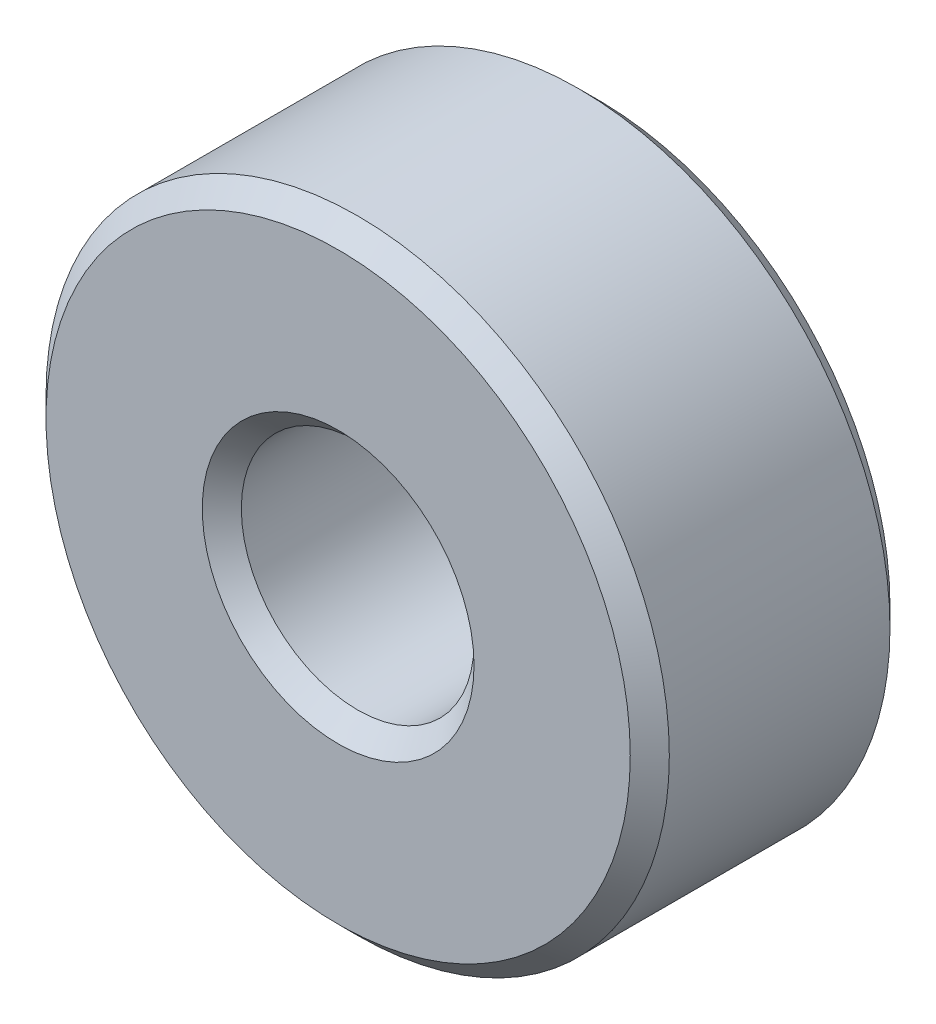
ISO-10303-21;
HEADER;
FILE_DESCRIPTION(('STEP AP214'),'2;1');
FILE_NAME('part.step','',(''),(''),'','','');
FILE_SCHEMA(('AUTOMOTIVE_DESIGN { 1 0 10303 214 1 1 1 1 }'));
ENDSEC;
DATA;
#1=APPLICATION_CONTEXT('core data for automotive mechanical design processes');
#2=APPLICATION_PROTOCOL_DEFINITION('international standard','automotive_design',2000,#1);
#3=PRODUCT_CONTEXT('',#1,'mechanical');
#4=PRODUCT('Part','Part','',(#3));
#5=PRODUCT_RELATED_PRODUCT_CATEGORY('part','',(#4));
#6=PRODUCT_DEFINITION_FORMATION('','',#4);
#7=PRODUCT_DEFINITION_CONTEXT('part definition',#1,'design');
#8=PRODUCT_DEFINITION('design','',#6,#7);
#9=PRODUCT_DEFINITION_SHAPE('','',#8);
#10=(LENGTH_UNIT() NAMED_UNIT(*) SI_UNIT(.MILLI.,.METRE.));
#11=(NAMED_UNIT(*) PLANE_ANGLE_UNIT() SI_UNIT($,.RADIAN.));
#12=(NAMED_UNIT(*) SI_UNIT($,.STERADIAN.) SOLID_ANGLE_UNIT());
#13=UNCERTAINTY_MEASURE_WITH_UNIT(LENGTH_MEASURE(1.E-05),#10,'distance_accuracy_value','');
#14=(GEOMETRIC_REPRESENTATION_CONTEXT(3) GLOBAL_UNCERTAINTY_ASSIGNED_CONTEXT((#13)) GLOBAL_UNIT_ASSIGNED_CONTEXT((#10,
#11,#12)) REPRESENTATION_CONTEXT('',''));
#15=CARTESIAN_POINT('',(0.,0.,0.));
#16=DIRECTION('',(0.,0.,1.));
#17=DIRECTION('',(1.,0.,0.));
#18=AXIS2_PLACEMENT_3D('',#15,#16,#17);
#19=CARTESIAN_POINT('',(0.,0.,-1.984375));
#20=DIRECTION('',(0.,0.,1.));
#21=DIRECTION('',(1.,0.,0.));
#22=AXIS2_PLACEMENT_3D('',#19,#20,#21);
#23=CYLINDRICAL_SURFACE('',#22,4.7625);
#24=CARTESIAN_POINT('',(0.,0.,1.685925));
#25=DIRECTION('',(0.,0.,1.));
#26=DIRECTION('',(1.,0.,0.));
#27=AXIS2_PLACEMENT_3D('',#24,#25,#26);
#28=CIRCLE('',#27,4.7625);
#29=CARTESIAN_POINT('',(4.7625,0.,1.685925));
#30=VERTEX_POINT('',#29);
#31=EDGE_CURVE('E57',#30,#30,#28,.F.);
#32=ORIENTED_EDGE('',*,*,#31,.T.);
#33=EDGE_LOOP('',(#32));
#34=FACE_BOUND('',#33,.T.);
#35=CARTESIAN_POINT('',(0.,0.,-1.685925));
#36=DIRECTION('',(0.,0.,1.));
#37=DIRECTION('',(1.,0.,0.));
#38=AXIS2_PLACEMENT_3D('',#35,#36,#37);
#39=CIRCLE('',#38,4.7625);
#40=CARTESIAN_POINT('',(4.7625,0.,-1.685925));
#41=VERTEX_POINT('',#40);
#42=EDGE_CURVE('E60',#41,#41,#39,.T.);
#43=ORIENTED_EDGE('',*,*,#42,.T.);
#44=EDGE_LOOP('',(#43));
#45=FACE_BOUND('',#44,.T.);
#46=ADVANCED_FACE('F37',(#34,#45),#23,.T.);
#47=CARTESIAN_POINT('',(0.,0.,-1.984375));
#48=DIRECTION('',(0.,0.,1.));
#49=DIRECTION('',(1.,0.,0.));
#50=AXIS2_PLACEMENT_3D('',#47,#48,#49);
#51=PLANE('',#50);
#52=CARTESIAN_POINT('',(0.,0.,-1.984375));
#53=DIRECTION('',(0.,0.,1.));
#54=DIRECTION('',(1.,0.,0.));
#55=AXIS2_PLACEMENT_3D('',#52,#53,#54);
#56=CIRCLE('',#55,4.46405);
#57=CARTESIAN_POINT('',(4.46405,0.,-1.984375));
#58=VERTEX_POINT('',#57);
#59=EDGE_CURVE('E48',#58,#58,#56,.F.);
#60=ORIENTED_EDGE('',*,*,#59,.T.);
#61=EDGE_LOOP('',(#60));
#62=FACE_BOUND('',#61,.T.);
#63=CARTESIAN_POINT('',(0.,0.,-1.984375));
#64=DIRECTION('',(0.,0.,1.));
#65=DIRECTION('',(1.,0.,0.));
#66=AXIS2_PLACEMENT_3D('',#63,#64,#65);
#67=CIRCLE('',#66,2.07645);
#68=CARTESIAN_POINT('',(2.07645,0.,-1.984375));
#69=VERTEX_POINT('',#68);
#70=EDGE_CURVE('E52',#69,#69,#67,.T.);
#71=ORIENTED_EDGE('',*,*,#70,.T.);
#72=EDGE_LOOP('',(#71));
#73=FACE_BOUND('',#72,.T.);
#74=ADVANCED_FACE('F85',(#62,#73),#51,.F.);
#75=CARTESIAN_POINT('',(0.,0.,-1.984375));
#76=DIRECTION('',(0.,0.,1.));
#77=DIRECTION('',(1.,0.,0.));
#78=AXIS2_PLACEMENT_3D('',#75,#76,#77);
#79=CYLINDRICAL_SURFACE('',#78,1.778);
#80=CARTESIAN_POINT('',(0.,0.,1.685925));
#81=DIRECTION('',(0.,0.,1.));
#82=DIRECTION('',(1.,0.,0.));
#83=AXIS2_PLACEMENT_3D('',#80,#81,#82);
#84=CIRCLE('',#83,1.778);
#85=CARTESIAN_POINT('',(1.778,0.,1.685925));
#86=VERTEX_POINT('',#85);
#87=EDGE_CURVE('E10',#86,#86,#84,.T.);
#88=ORIENTED_EDGE('',*,*,#87,.T.);
#89=EDGE_LOOP('',(#88));
#90=FACE_BOUND('',#89,.T.);
#91=CARTESIAN_POINT('',(0.,0.,-1.685925));
#92=DIRECTION('',(0.,0.,1.));
#93=DIRECTION('',(1.,0.,0.));
#94=AXIS2_PLACEMENT_3D('',#91,#92,#93);
#95=CIRCLE('',#94,1.778);
#96=CARTESIAN_POINT('',(1.778,0.,-1.685925));
#97=VERTEX_POINT('',#96);
#98=EDGE_CURVE('E44',#97,#97,#95,.F.);
#99=ORIENTED_EDGE('',*,*,#98,.T.);
#100=EDGE_LOOP('',(#99));
#101=FACE_BOUND('',#100,.T.);
#102=ADVANCED_FACE('F91',(#90,#101),#79,.F.);
#103=CARTESIAN_POINT('',(0.,0.,1.984375));
#104=DIRECTION('',(0.,0.,1.));
#105=DIRECTION('',(1.,0.,0.));
#106=AXIS2_PLACEMENT_3D('',#103,#104,#105);
#107=PLANE('',#106);
#108=CARTESIAN_POINT('',(0.,0.,1.984375));
#109=DIRECTION('',(0.,0.,1.));
#110=DIRECTION('',(1.,0.,0.));
#111=AXIS2_PLACEMENT_3D('',#108,#109,#110);
#112=CIRCLE('',#111,4.46405);
#113=CARTESIAN_POINT('',(4.46405,0.,1.984375));
#114=VERTEX_POINT('',#113);
#115=EDGE_CURVE('E63',#114,#114,#112,.T.);
#116=ORIENTED_EDGE('',*,*,#115,.T.);
#117=EDGE_LOOP('',(#116));
#118=FACE_BOUND('',#117,.T.);
#119=CARTESIAN_POINT('',(0.,0.,1.984375));
#120=DIRECTION('',(0.,0.,1.));
#121=DIRECTION('',(1.,0.,0.));
#122=AXIS2_PLACEMENT_3D('',#119,#120,#121);
#123=CIRCLE('',#122,2.07645000000001);
#124=CARTESIAN_POINT('',(2.07645000000001,0.,1.984375));
#125=VERTEX_POINT('',#124);
#126=EDGE_CURVE('E66',#125,#125,#123,.F.);
#127=ORIENTED_EDGE('',*,*,#126,.T.);
#128=EDGE_LOOP('',(#127));
#129=FACE_BOUND('',#128,.T.);
#130=ADVANCED_FACE('F70',(#118,#129),#107,.T.);
#131=CARTESIAN_POINT('',(0.,0.,1.984375));
#132=DIRECTION('',(0.,0.,-1.));
#133=DIRECTION('',(-1.,0.,0.));
#134=AXIS2_PLACEMENT_3D('',#131,#132,#133);
#135=CONICAL_SURFACE('',#134,4.46405,0.785398163397444);
#136=ORIENTED_EDGE('',*,*,#31,.F.);
#137=EDGE_LOOP('',(#136));
#138=FACE_BOUND('',#137,.T.);
#139=ORIENTED_EDGE('',*,*,#115,.F.);
#140=EDGE_LOOP('',(#139));
#141=FACE_BOUND('',#140,.T.);
#142=ADVANCED_FACE('F81',(#138,#141),#135,.T.);
#143=CARTESIAN_POINT('',(0.,0.,-1.685925));
#144=DIRECTION('',(0.,0.,1.));
#145=DIRECTION('',(1.,0.,0.));
#146=AXIS2_PLACEMENT_3D('',#143,#144,#145);
#147=CONICAL_SURFACE('',#146,4.7625,0.785398163397447);
#148=ORIENTED_EDGE('',*,*,#59,.F.);
#149=EDGE_LOOP('',(#148));
#150=FACE_BOUND('',#149,.T.);
#151=ORIENTED_EDGE('',*,*,#42,.F.);
#152=EDGE_LOOP('',(#151));
#153=FACE_BOUND('',#152,.T.);
#154=ADVANCED_FACE('F75',(#150,#153),#147,.T.);
#155=CARTESIAN_POINT('',(0.,0.,1.685925));
#156=DIRECTION('',(0.,0.,1.));
#157=DIRECTION('',(1.,0.,0.));
#158=AXIS2_PLACEMENT_3D('',#155,#156,#157);
#159=CONICAL_SURFACE('',#158,1.778,0.785398163397453);
#160=ORIENTED_EDGE('',*,*,#126,.F.);
#161=EDGE_LOOP('',(#160));
#162=FACE_BOUND('',#161,.T.);
#163=ORIENTED_EDGE('',*,*,#87,.F.);
#164=EDGE_LOOP('',(#163));
#165=FACE_BOUND('',#164,.T.);
#166=ADVANCED_FACE('F72',(#162,#165),#159,.F.);
#167=CARTESIAN_POINT('',(0.,0.,-1.984375));
#168=DIRECTION('',(0.,0.,-1.));
#169=DIRECTION('',(-1.,0.,0.));
#170=AXIS2_PLACEMENT_3D('',#167,#168,#169);
#171=CONICAL_SURFACE('',#170,2.07645,0.785398163397448);
#172=ORIENTED_EDGE('',*,*,#98,.F.);
#173=EDGE_LOOP('',(#172));
#174=FACE_BOUND('',#173,.T.);
#175=ORIENTED_EDGE('',*,*,#70,.F.);
#176=EDGE_LOOP('',(#175));
#177=FACE_BOUND('',#176,.T.);
#178=ADVANCED_FACE('F39',(#174,#177),#171,.F.);
#179=CLOSED_SHELL('',(#46,#74,#102,#130,#142,#154,#166,#178));
#180=MANIFOLD_SOLID_BREP('B2',#179);
#181=ADVANCED_BREP_SHAPE_REPRESENTATION('',(#18,#180),#14);
#182=SHAPE_DEFINITION_REPRESENTATION(#9,#181);
ENDSEC;
END-ISO-10303-21;
